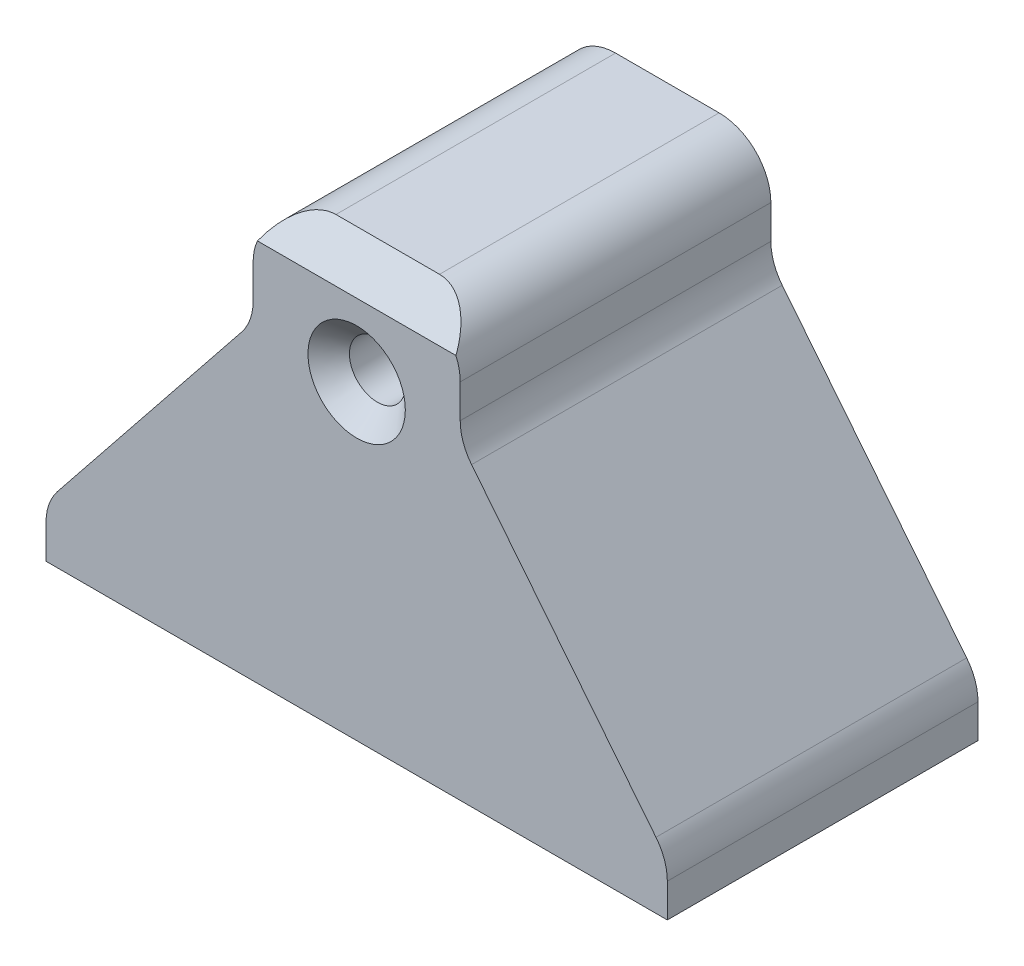
ISO-10303-21;
HEADER;
FILE_DESCRIPTION(('STEP AP214'),'2;1');
FILE_NAME('part.step','',(''),(''),'','','');
FILE_SCHEMA(('AUTOMOTIVE_DESIGN { 1 0 10303 214 1 1 1 1 }'));
ENDSEC;
DATA;
#1=APPLICATION_CONTEXT('core data for automotive mechanical design processes');
#2=APPLICATION_PROTOCOL_DEFINITION('international standard','automotive_design',2000,#1);
#3=PRODUCT_CONTEXT('',#1,'mechanical');
#4=PRODUCT('Part','Part','',(#3));
#5=PRODUCT_RELATED_PRODUCT_CATEGORY('part','',(#4));
#6=PRODUCT_DEFINITION_FORMATION('','',#4);
#7=PRODUCT_DEFINITION_CONTEXT('part definition',#1,'design');
#8=PRODUCT_DEFINITION('design','',#6,#7);
#9=PRODUCT_DEFINITION_SHAPE('','',#8);
#10=(LENGTH_UNIT() NAMED_UNIT(*) SI_UNIT(.MILLI.,.METRE.));
#11=(NAMED_UNIT(*) PLANE_ANGLE_UNIT() SI_UNIT($,.RADIAN.));
#12=(NAMED_UNIT(*) SI_UNIT($,.STERADIAN.) SOLID_ANGLE_UNIT());
#13=UNCERTAINTY_MEASURE_WITH_UNIT(LENGTH_MEASURE(1.E-05),#10,'distance_accuracy_value','');
#14=(GEOMETRIC_REPRESENTATION_CONTEXT(3) GLOBAL_UNCERTAINTY_ASSIGNED_CONTEXT((#13)) GLOBAL_UNIT_ASSIGNED_CONTEXT((#10,
#11,#12)) REPRESENTATION_CONTEXT('',''));
#15=CARTESIAN_POINT('',(0.,0.,0.));
#16=DIRECTION('',(0.,0.,1.));
#17=DIRECTION('',(1.,0.,0.));
#18=AXIS2_PLACEMENT_3D('',#15,#16,#17);
#19=CARTESIAN_POINT('',(12.7,0.,38.1));
#20=DIRECTION('',(1.,0.,0.));
#21=DIRECTION('',(0.,1.,0.));
#22=AXIS2_PLACEMENT_3D('',#19,#20,#21);
#23=PLANE('',#22);
#24=DIRECTION('',(0.,-1.,0.));
#25=VECTOR('',#24,1.);
#26=CARTESIAN_POINT('',(12.7,0.,0.));
#27=LINE('',#26,#25);
#28=CARTESIAN_POINT('',(12.7,6.35,0.));
#29=VERTEX_POINT('',#28);
#30=CARTESIAN_POINT('',(12.7,2.22745972692465,0.));
#31=VERTEX_POINT('',#30);
#32=EDGE_CURVE('E288',#29,#31,#27,.T.);
#33=ORIENTED_EDGE('',*,*,#32,.F.);
#34=DIRECTION('',(0.,0.,-1.));
#35=VECTOR('',#34,1.);
#36=CARTESIAN_POINT('',(12.7,6.35,38.1));
#37=LINE('',#36,#35);
#38=CARTESIAN_POINT('',(12.7,6.35,38.1));
#39=VERTEX_POINT('',#38);
#40=EDGE_CURVE('E395',#29,#39,#37,.F.);
#41=ORIENTED_EDGE('',*,*,#40,.T.);
#42=DIRECTION('',(0.,-1.,0.));
#43=VECTOR('',#42,1.);
#44=CARTESIAN_POINT('',(12.7,0.,38.1));
#45=LINE('',#44,#43);
#46=CARTESIAN_POINT('',(12.7,2.22745972692465,38.1));
#47=VERTEX_POINT('',#46);
#48=EDGE_CURVE('E265',#39,#47,#45,.T.);
#49=ORIENTED_EDGE('',*,*,#48,.T.);
#50=DIRECTION('',(0.,0.,-1.));
#51=VECTOR('',#50,1.);
#52=CARTESIAN_POINT('',(12.7,2.22745972692465,38.1));
#53=LINE('',#52,#51);
#54=EDGE_CURVE('E392',#47,#31,#53,.T.);
#55=ORIENTED_EDGE('',*,*,#54,.T.);
#56=EDGE_LOOP('',(#33,#41,#49,#55));
#57=FACE_BOUND('',#56,.T.);
#58=ADVANCED_FACE('F52',(#57),#23,.T.);
#59=CARTESIAN_POINT('',(0.,12.7,38.1));
#60=DIRECTION('',(0.,1.,0.));
#61=DIRECTION('',(0.,0.,1.));
#62=AXIS2_PLACEMENT_3D('',#59,#60,#61);
#63=PLANE('',#62);
#64=DIRECTION('',(0.,0.,-1.));
#65=VECTOR('',#64,1.);
#66=CARTESIAN_POINT('',(-6.35,12.7,38.1));
#67=LINE('',#66,#65);
#68=CARTESIAN_POINT('',(-6.35,12.7,0.));
#69=VERTEX_POINT('',#68);
#70=CARTESIAN_POINT('',(-6.35,12.7,34.29));
#71=VERTEX_POINT('',#70);
#72=EDGE_CURVE('E389',#69,#71,#67,.F.);
#73=ORIENTED_EDGE('',*,*,#72,.T.);
#74=DIRECTION('',(1.,0.,0.));
#75=VECTOR('',#74,1.);
#76=CARTESIAN_POINT('',(0.,12.7,34.29));
#77=LINE('',#76,#75);
#78=CARTESIAN_POINT('',(6.35,12.7,34.29));
#79=VERTEX_POINT('',#78);
#80=EDGE_CURVE('E412',#71,#79,#77,.T.);
#81=ORIENTED_EDGE('',*,*,#80,.T.);
#82=DIRECTION('',(0.,0.,-1.));
#83=VECTOR('',#82,1.);
#84=CARTESIAN_POINT('',(6.35,12.7,38.1));
#85=LINE('',#84,#83);
#86=CARTESIAN_POINT('',(6.35,12.7,0.));
#87=VERTEX_POINT('',#86);
#88=EDGE_CURVE('E387',#79,#87,#85,.T.);
#89=ORIENTED_EDGE('',*,*,#88,.T.);
#90=DIRECTION('',(1.,0.,0.));
#91=VECTOR('',#90,1.);
#92=CARTESIAN_POINT('',(0.,12.7,0.));
#93=LINE('',#92,#91);
#94=EDGE_CURVE('E291',#69,#87,#93,.T.);
#95=ORIENTED_EDGE('',*,*,#94,.F.);
#96=EDGE_LOOP('',(#73,#81,#89,#95));
#97=FACE_BOUND('',#96,.T.);
#98=ADVANCED_FACE('F417',(#97),#63,.T.);
#99=CARTESIAN_POINT('',(-12.7,0.,38.1));
#100=DIRECTION('',(1.,0.,0.));
#101=DIRECTION('',(0.,1.,0.));
#102=AXIS2_PLACEMENT_3D('',#99,#100,#101);
#103=PLANE('',#102);
#104=DIRECTION('',(0.,-1.,0.));
#105=VECTOR('',#104,1.);
#106=CARTESIAN_POINT('',(-12.7,0.,0.));
#107=LINE('',#106,#105);
#108=CARTESIAN_POINT('',(-12.7,6.35,0.));
#109=VERTEX_POINT('',#108);
#110=CARTESIAN_POINT('',(-12.7,2.22745972692465,0.));
#111=VERTEX_POINT('',#110);
#112=EDGE_CURVE('E294',#109,#111,#107,.T.);
#113=ORIENTED_EDGE('',*,*,#112,.T.);
#114=DIRECTION('',(0.,0.,-1.));
#115=VECTOR('',#114,1.);
#116=CARTESIAN_POINT('',(-12.7,2.22745972692465,38.1));
#117=LINE('',#116,#115);
#118=CARTESIAN_POINT('',(-12.7,2.22745972692465,38.1));
#119=VERTEX_POINT('',#118);
#120=EDGE_CURVE('E385',#111,#119,#117,.F.);
#121=ORIENTED_EDGE('',*,*,#120,.T.);
#122=DIRECTION('',(0.,-1.,0.));
#123=VECTOR('',#122,1.);
#124=CARTESIAN_POINT('',(-12.7,0.,38.1));
#125=LINE('',#124,#123);
#126=CARTESIAN_POINT('',(-12.7,6.35,38.1));
#127=VERTEX_POINT('',#126);
#128=EDGE_CURVE('E268',#127,#119,#125,.T.);
#129=ORIENTED_EDGE('',*,*,#128,.F.);
#130=DIRECTION('',(0.,0.,-1.));
#131=VECTOR('',#130,1.);
#132=CARTESIAN_POINT('',(-12.7,6.35,0.));
#133=LINE('',#132,#131);
#134=EDGE_CURVE('E382',#127,#109,#133,.T.);
#135=ORIENTED_EDGE('',*,*,#134,.T.);
#136=EDGE_LOOP('',(#113,#121,#129,#135));
#137=FACE_BOUND('',#136,.T.);
#138=ADVANCED_FACE('F445',(#137),#103,.F.);
#139=CARTESIAN_POINT('',(-7.74390243902439,6.19512195121951,38.1));
#140=DIRECTION('',(-0.78086880944303,0.624695047554424,0.));
#141=DIRECTION('',(-0.624695047554424,-0.78086880944303,0.));
#142=AXIS2_PLACEMENT_3D('',#139,#140,#141);
#143=PLANE('',#142);
#144=DIRECTION('',(0.624695047554424,0.78086880944303,0.));
#145=VECTOR('',#144,1.);
#146=CARTESIAN_POINT('',(-7.74390243902439,6.19512195121951,0.));
#147=LINE('',#146,#145);
#148=CARTESIAN_POINT('',(-36.7085169399632,-30.0106461749541,0.));
#149=VERTEX_POINT('',#148);
#150=CARTESIAN_POINT('',(-14.0914830600368,-1.73935382504595,0.));
#151=VERTEX_POINT('',#150);
#152=EDGE_CURVE('E297',#149,#151,#147,.T.);
#153=ORIENTED_EDGE('',*,*,#152,.F.);
#154=DIRECTION('',(0.,0.,-1.));
#155=VECTOR('',#154,1.);
#156=CARTESIAN_POINT('',(-36.7085169399632,-30.0106461749541,38.1));
#157=LINE('',#156,#155);
#158=CARTESIAN_POINT('',(-36.7085169399632,-30.0106461749541,38.1));
#159=VERTEX_POINT('',#158);
#160=EDGE_CURVE('E372',#149,#159,#157,.F.);
#161=ORIENTED_EDGE('',*,*,#160,.T.);
#162=DIRECTION('',(0.624695047554424,0.78086880944303,0.));
#163=VECTOR('',#162,1.);
#164=CARTESIAN_POINT('',(-7.74390243902439,6.19512195121951,38.1));
#165=LINE('',#164,#163);
#166=CARTESIAN_POINT('',(-14.0914830600368,-1.73935382504595,38.1));
#167=VERTEX_POINT('',#166);
#168=EDGE_CURVE('E272',#159,#167,#165,.T.);
#169=ORIENTED_EDGE('',*,*,#168,.T.);
#170=DIRECTION('',(0.,0.,-1.));
#171=VECTOR('',#170,1.);
#172=CARTESIAN_POINT('',(-14.0914830600368,-1.73935382504595,38.1));
#173=LINE('',#172,#171);
#174=EDGE_CURVE('E369',#167,#151,#173,.T.);
#175=ORIENTED_EDGE('',*,*,#174,.T.);
#176=EDGE_LOOP('',(#153,#161,#169,#175));
#177=FACE_BOUND('',#176,.T.);
#178=ADVANCED_FACE('F549',(#177),#143,.T.);
#179=CARTESIAN_POINT('',(-38.1,0.,38.1));
#180=DIRECTION('',(-1.,0.,0.));
#181=DIRECTION('',(0.,0.,1.));
#182=AXIS2_PLACEMENT_3D('',#179,#180,#181);
#183=PLANE('',#182);
#184=DIRECTION('',(0.,1.,0.));
#185=VECTOR('',#184,1.);
#186=CARTESIAN_POINT('',(-38.1,0.,38.1));
#187=LINE('',#186,#185);
#188=CARTESIAN_POINT('',(-38.1,-38.1,38.1));
#189=VERTEX_POINT('',#188);
#190=CARTESIAN_POINT('',(-38.1,-33.9774597269247,38.1));
#191=VERTEX_POINT('',#190);
#192=EDGE_CURVE('E275',#189,#191,#187,.T.);
#193=ORIENTED_EDGE('',*,*,#192,.T.);
#194=DIRECTION('',(0.,0.,-1.));
#195=VECTOR('',#194,1.);
#196=CARTESIAN_POINT('',(-38.1,-33.9774597269247,38.1));
#197=LINE('',#196,#195);
#198=CARTESIAN_POINT('',(-38.1,-33.9774597269247,0.));
#199=VERTEX_POINT('',#198);
#200=EDGE_CURVE('E358',#191,#199,#197,.T.);
#201=ORIENTED_EDGE('',*,*,#200,.T.);
#202=DIRECTION('',(0.,1.,0.));
#203=VECTOR('',#202,1.);
#204=CARTESIAN_POINT('',(-38.1,0.,0.));
#205=LINE('',#204,#203);
#206=CARTESIAN_POINT('',(-38.1,-38.1,0.));
#207=VERTEX_POINT('',#206);
#208=EDGE_CURVE('E300',#207,#199,#205,.T.);
#209=ORIENTED_EDGE('',*,*,#208,.F.);
#210=DIRECTION('',(0.,0.,-1.));
#211=VECTOR('',#210,1.);
#212=CARTESIAN_POINT('',(-38.1,-38.1,38.1));
#213=LINE('',#212,#211);
#214=EDGE_CURVE('E312',#189,#207,#213,.T.);
#215=ORIENTED_EDGE('',*,*,#214,.F.);
#216=EDGE_LOOP('',(#193,#201,#209,#215));
#217=FACE_BOUND('',#216,.T.);
#218=ADVANCED_FACE('F542',(#217),#183,.T.);
#219=CARTESIAN_POINT('',(0.,-38.1,38.1));
#220=DIRECTION('',(0.,-1.,0.));
#221=DIRECTION('',(1.,0.,0.));
#222=AXIS2_PLACEMENT_3D('',#219,#220,#221);
#223=PLANE('',#222);
#224=DIRECTION('',(-1.,0.,0.));
#225=VECTOR('',#224,1.);
#226=CARTESIAN_POINT('',(0.,-38.1,0.));
#227=LINE('',#226,#225);
#228=CARTESIAN_POINT('',(38.1,-38.1,0.));
#229=VERTEX_POINT('',#228);
#230=EDGE_CURVE('E303',#229,#207,#227,.T.);
#231=ORIENTED_EDGE('',*,*,#230,.F.);
#232=DIRECTION('',(0.,0.,-1.));
#233=VECTOR('',#232,1.);
#234=CARTESIAN_POINT('',(38.1,-38.1,38.1));
#235=LINE('',#234,#233);
#236=CARTESIAN_POINT('',(38.1,-38.1,38.1));
#237=VERTEX_POINT('',#236);
#238=EDGE_CURVE('E287',#237,#229,#235,.T.);
#239=ORIENTED_EDGE('',*,*,#238,.F.);
#240=DIRECTION('',(-1.,0.,0.));
#241=VECTOR('',#240,1.);
#242=CARTESIAN_POINT('',(0.,-38.1,38.1));
#243=LINE('',#242,#241);
#244=EDGE_CURVE('E278',#237,#189,#243,.T.);
#245=ORIENTED_EDGE('',*,*,#244,.T.);
#246=ORIENTED_EDGE('',*,*,#214,.T.);
#247=EDGE_LOOP('',(#231,#239,#245,#246));
#248=FACE_BOUND('',#247,.T.);
#249=ADVANCED_FACE('F538',(#248),#223,.T.);
#250=CARTESIAN_POINT('',(38.1,0.,38.1));
#251=DIRECTION('',(-1.,0.,0.));
#252=DIRECTION('',(0.,0.,1.));
#253=AXIS2_PLACEMENT_3D('',#250,#251,#252);
#254=PLANE('',#253);
#255=DIRECTION('',(0.,1.,0.));
#256=VECTOR('',#255,1.);
#257=CARTESIAN_POINT('',(38.1,0.,0.));
#258=LINE('',#257,#256);
#259=CARTESIAN_POINT('',(38.1,-33.9774597269246,0.));
#260=VERTEX_POINT('',#259);
#261=EDGE_CURVE('E306',#229,#260,#258,.T.);
#262=ORIENTED_EDGE('',*,*,#261,.T.);
#263=DIRECTION('',(0.,0.,-1.));
#264=VECTOR('',#263,1.);
#265=CARTESIAN_POINT('',(38.1,-33.9774597269246,38.1));
#266=LINE('',#265,#264);
#267=CARTESIAN_POINT('',(38.1,-33.9774597269246,38.1));
#268=VERTEX_POINT('',#267);
#269=EDGE_CURVE('E402',#260,#268,#266,.F.);
#270=ORIENTED_EDGE('',*,*,#269,.T.);
#271=DIRECTION('',(0.,1.,0.));
#272=VECTOR('',#271,1.);
#273=CARTESIAN_POINT('',(38.1,0.,38.1));
#274=LINE('',#273,#272);
#275=EDGE_CURVE('E281',#237,#268,#274,.T.);
#276=ORIENTED_EDGE('',*,*,#275,.F.);
#277=ORIENTED_EDGE('',*,*,#238,.T.);
#278=EDGE_LOOP('',(#262,#270,#276,#277));
#279=FACE_BOUND('',#278,.T.);
#280=ADVANCED_FACE('F453',(#279),#254,.F.);
#281=CARTESIAN_POINT('',(0.,0.,38.1));
#282=DIRECTION('',(0.,0.,-1.));
#283=DIRECTION('',(-1.,0.,0.));
#284=AXIS2_PLACEMENT_3D('',#281,#282,#283);
#285=CYLINDRICAL_SURFACE('',#284,3.429);
#286=CARTESIAN_POINT('',(0.,0.,35.56));
#287=DIRECTION('',(0.,0.,1.));
#288=DIRECTION('',(1.,0.,0.));
#289=AXIS2_PLACEMENT_3D('',#286,#287,#288);
#290=CIRCLE('',#289,3.429);
#291=CARTESIAN_POINT('',(-3.429,0.,35.5599999999999));
#292=VERTEX_POINT('',#291);
#293=EDGE_CURVE('E340',#292,#292,#290,.T.);
#294=CARTESIAN_POINT('',(0.,0.,19.05));
#295=DIRECTION('',(0.,0.,1.));
#296=DIRECTION('',(1.,0.,0.));
#297=AXIS2_PLACEMENT_3D('',#294,#295,#296);
#298=CIRCLE('',#297,3.429);
#299=CARTESIAN_POINT('',(-3.429,0.,19.05));
#300=VERTEX_POINT('',#299);
#301=EDGE_CURVE('E264',#300,#300,#298,.T.);
#302=CARTESIAN_POINT('',(-3.429,0.,35.5599999999999));
#303=CARTESIAN_POINT('',(-3.429,0.,35.3880208333333));
#304=CARTESIAN_POINT('',(-3.429,0.,35.2160416666666));
#305=CARTESIAN_POINT('',(-3.429,0.,34.8720833333333));
#306=CARTESIAN_POINT('',(-3.429,0.,34.7001041666666));
#307=CARTESIAN_POINT('',(-3.429,0.,34.3561458333333));
#308=CARTESIAN_POINT('',(-3.429,0.,34.1841666666666));
#309=CARTESIAN_POINT('',(-3.429,0.,33.8402083333333));
#310=CARTESIAN_POINT('',(-3.429,0.,33.6682291666666));
#311=CARTESIAN_POINT('',(-3.429,0.,33.3242708333333));
#312=CARTESIAN_POINT('',(-3.429,0.,33.1522916666666));
#313=CARTESIAN_POINT('',(-3.429,0.,32.8083333333333));
#314=CARTESIAN_POINT('',(-3.429,0.,32.6363541666666));
#315=CARTESIAN_POINT('',(-3.429,0.,32.2923958333333));
#316=CARTESIAN_POINT('',(-3.429,0.,32.1204166666666));
#317=CARTESIAN_POINT('',(-3.429,0.,31.7764583333333));
#318=CARTESIAN_POINT('',(-3.429,0.,31.6044791666666));
#319=CARTESIAN_POINT('',(-3.429,0.,31.2605208333333));
#320=CARTESIAN_POINT('',(-3.429,0.,31.0885416666666));
#321=CARTESIAN_POINT('',(-3.429,0.,30.7445833333333));
#322=CARTESIAN_POINT('',(-3.429,0.,30.5726041666666));
#323=CARTESIAN_POINT('',(-3.429,0.,30.2286458333333));
#324=CARTESIAN_POINT('',(-3.429,0.,30.0566666666666));
#325=CARTESIAN_POINT('',(-3.429,0.,29.7127083333333));
#326=CARTESIAN_POINT('',(-3.429,0.,29.5407291666666));
#327=CARTESIAN_POINT('',(-3.429,0.,29.1967708333333));
#328=CARTESIAN_POINT('',(-3.429,0.,29.0247916666666));
#329=CARTESIAN_POINT('',(-3.429,0.,28.6808333333333));
#330=CARTESIAN_POINT('',(-3.429,0.,28.5088541666666));
#331=CARTESIAN_POINT('',(-3.429,0.,28.1648958333333));
#332=CARTESIAN_POINT('',(-3.429,0.,27.9929166666666));
#333=CARTESIAN_POINT('',(-3.429,0.,27.6489583333333));
#334=CARTESIAN_POINT('',(-3.429,0.,27.4769791666666));
#335=CARTESIAN_POINT('',(-3.429,0.,27.1330208333333));
#336=CARTESIAN_POINT('',(-3.429,0.,26.9610416666666));
#337=CARTESIAN_POINT('',(-3.429,0.,26.6170833333333));
#338=CARTESIAN_POINT('',(-3.429,0.,26.4451041666666));
#339=CARTESIAN_POINT('',(-3.429,0.,26.1011458333333));
#340=CARTESIAN_POINT('',(-3.429,0.,25.9291666666666));
#341=CARTESIAN_POINT('',(-3.429,0.,25.5852083333333));
#342=CARTESIAN_POINT('',(-3.429,0.,25.4132291666666));
#343=CARTESIAN_POINT('',(-3.429,0.,25.0692708333333));
#344=CARTESIAN_POINT('',(-3.429,0.,24.8972916666666));
#345=CARTESIAN_POINT('',(-3.429,0.,24.5533333333333));
#346=CARTESIAN_POINT('',(-3.429,0.,24.3813541666667));
#347=CARTESIAN_POINT('',(-3.429,0.,24.0373958333333));
#348=CARTESIAN_POINT('',(-3.429,0.,23.8654166666667));
#349=CARTESIAN_POINT('',(-3.429,0.,23.5214583333333));
#350=CARTESIAN_POINT('',(-3.429,0.,23.3494791666667));
#351=CARTESIAN_POINT('',(-3.429,0.,23.0055208333333));
#352=CARTESIAN_POINT('',(-3.429,0.,22.8335416666667));
#353=CARTESIAN_POINT('',(-3.429,0.,22.4895833333333));
#354=CARTESIAN_POINT('',(-3.429,0.,22.3176041666667));
#355=CARTESIAN_POINT('',(-3.429,0.,21.9736458333333));
#356=CARTESIAN_POINT('',(-3.429,0.,21.8016666666667));
#357=CARTESIAN_POINT('',(-3.429,0.,21.4577083333333));
#358=CARTESIAN_POINT('',(-3.429,0.,21.2857291666667));
#359=CARTESIAN_POINT('',(-3.429,0.,20.9417708333333));
#360=CARTESIAN_POINT('',(-3.429,0.,20.7697916666667));
#361=CARTESIAN_POINT('',(-3.429,0.,20.4258333333333));
#362=CARTESIAN_POINT('',(-3.429,0.,20.2538541666667));
#363=CARTESIAN_POINT('',(-3.429,0.,19.9098958333333));
#364=CARTESIAN_POINT('',(-3.429,0.,19.7379166666667));
#365=CARTESIAN_POINT('',(-3.429,0.,19.3939583333333));
#366=CARTESIAN_POINT('',(-3.429,0.,19.2219791666667));
#367=CARTESIAN_POINT('',(-3.429,0.,19.05));
#368=B_SPLINE_CURVE_WITH_KNOTS('',3,(#302,#303,#304,#305,#306,#307,#308,#309,#310,#311,#312,
#313,#314,#315,#316,#317,#318,#319,#320,#321,#322,#323,#324,#325,#326,#327,#328,#329,#330,#331,
#332,#333,#334,#335,#336,#337,#338,#339,#340,#341,#342,#343,#344,#345,#346,#347,#348,#349,#350,
#351,#352,#353,#354,#355,#356,#357,#358,#359,#360,#361,#362,#363,#364,#365,#366,#367),
.UNSPECIFIED.,.F.,.F.,(4,2,2,2,2,2,2,2,2,2,2,2,2,2,2,2,2,2,2,2,2,2,2,2,2,2,2,2,2,2,2,2,4),(0.,
0.515937499999994,1.03187499999999,1.54781249999999,2.06374999999999,2.57968749999999,
3.09562499999998,3.61156249999998,4.12749999999999,4.64343749999998,5.15937499999998,
5.67531249999998,6.19124999999997,6.70718749999997,7.22312499999998,7.73906249999997,
8.25499999999997,8.77093749999997,9.28687499999996,9.80281249999997,10.31875,10.8346875,
11.350625,11.8665625,12.3825,12.8984375,13.414375,13.9303125,14.44625,14.9621874999999,
15.478125,15.9940624999999,16.5099999999999),.UNSPECIFIED.);
#369=EDGE_CURVE('BSEAM449',#292,#300,#368,.T.);
#370=ORIENTED_EDGE('',*,*,#293,.T.);
#371=ORIENTED_EDGE('',*,*,#301,.F.);
#372=ORIENTED_EDGE('',*,*,#369,.T.);
#373=ORIENTED_EDGE('',*,*,#369,.F.);
#374=EDGE_LOOP('',(#370,#372,#371,#373));
#375=FACE_BOUND('',#374,.T.);
#376=ADVANCED_FACE('F449',(#375),#285,.F.);
#377=CARTESIAN_POINT('',(7.74390243902439,6.19512195121952,38.1));
#378=DIRECTION('',(-0.78086880944303,-0.624695047554424,0.));
#379=DIRECTION('',(0.624695047554424,-0.78086880944303,0.));
#380=AXIS2_PLACEMENT_3D('',#377,#378,#379);
#381=PLANE('',#380);
#382=DIRECTION('',(-0.624695047554424,0.78086880944303,0.));
#383=VECTOR('',#382,1.);
#384=CARTESIAN_POINT('',(7.74390243902439,6.19512195121952,38.1));
#385=LINE('',#384,#383);
#386=CARTESIAN_POINT('',(36.7085169399632,-30.010646174954,38.1));
#387=VERTEX_POINT('',#386);
#388=CARTESIAN_POINT('',(14.0914830600368,-1.73935382504594,38.1));
#389=VERTEX_POINT('',#388);
#390=EDGE_CURVE('E284',#387,#389,#385,.T.);
#391=ORIENTED_EDGE('',*,*,#390,.F.);
#392=DIRECTION('',(0.,0.,-1.));
#393=VECTOR('',#392,1.);
#394=CARTESIAN_POINT('',(36.7085169399632,-30.010646174954,38.1));
#395=LINE('',#394,#393);
#396=CARTESIAN_POINT('',(36.7085169399632,-30.010646174954,0.));
#397=VERTEX_POINT('',#396);
#398=EDGE_CURVE('E399',#387,#397,#395,.T.);
#399=ORIENTED_EDGE('',*,*,#398,.T.);
#400=DIRECTION('',(-0.624695047554424,0.78086880944303,0.));
#401=VECTOR('',#400,1.);
#402=CARTESIAN_POINT('',(7.74390243902439,6.19512195121952,0.));
#403=LINE('',#402,#401);
#404=CARTESIAN_POINT('',(14.0914830600368,-1.73935382504594,0.));
#405=VERTEX_POINT('',#404);
#406=EDGE_CURVE('E269',#397,#405,#403,.T.);
#407=ORIENTED_EDGE('',*,*,#406,.T.);
#408=DIRECTION('',(0.,0.,-1.));
#409=VECTOR('',#408,1.);
#410=CARTESIAN_POINT('',(14.0914830600368,-1.73935382504594,38.1));
#411=LINE('',#410,#409);
#412=EDGE_CURVE('E397',#405,#389,#411,.F.);
#413=ORIENTED_EDGE('',*,*,#412,.T.);
#414=EDGE_LOOP('',(#391,#399,#407,#413));
#415=FACE_BOUND('',#414,.T.);
#416=ADVANCED_FACE('F452',(#415),#381,.F.);
#417=CARTESIAN_POINT('',(0.,0.,38.1));
#418=DIRECTION('',(0.,0.,1.));
#419=DIRECTION('',(1.,0.,0.));
#420=AXIS2_PLACEMENT_3D('',#417,#418,#419);
#421=PLANE('',#420);
#422=CARTESIAN_POINT('',(0.,0.,38.1));
#423=DIRECTION('',(0.,0.,1.));
#424=DIRECTION('',(1.,0.,0.));
#425=AXIS2_PLACEMENT_3D('',#422,#423,#424);
#426=CIRCLE('',#425,5.96900000000007);
#427=CARTESIAN_POINT('',(5.96900000000007,0.,38.1));
#428=VERTEX_POINT('',#427);
#429=EDGE_CURVE('E355',#428,#428,#426,.F.);
#430=ORIENTED_EDGE('',*,*,#429,.T.);
#431=EDGE_LOOP('',(#430));
#432=FACE_BOUND('',#431,.T.);
#433=CARTESIAN_POINT('',(6.35,6.35,38.1));
#434=DIRECTION('',(0.,0.,1.));
#435=DIRECTION('',(1.,0.,0.));
#436=AXIS2_PLACEMENT_3D('',#433,#434,#435);
#437=CIRCLE('',#436,6.35);
#438=CARTESIAN_POINT('',(12.1698711325939,8.89000000000001,38.1));
#439=VERTEX_POINT('',#438);
#440=EDGE_CURVE('E376',#39,#439,#437,.T.);
#441=ORIENTED_EDGE('',*,*,#440,.T.);
#442=DIRECTION('',(-1.,0.,0.));
#443=VECTOR('',#442,1.);
#444=CARTESIAN_POINT('',(0.,8.89000000000001,38.1));
#445=LINE('',#444,#443);
#446=CARTESIAN_POINT('',(-12.1698711325939,8.89000000000001,38.1));
#447=VERTEX_POINT('',#446);
#448=EDGE_CURVE('E61',#439,#447,#445,.T.);
#449=ORIENTED_EDGE('',*,*,#448,.T.);
#450=CARTESIAN_POINT('',(-6.35,6.35,38.1));
#451=DIRECTION('',(0.,0.,1.));
#452=DIRECTION('',(1.,0.,0.));
#453=AXIS2_PLACEMENT_3D('',#450,#451,#452);
#454=CIRCLE('',#453,6.35);
#455=EDGE_CURVE('E378',#447,#127,#454,.T.);
#456=ORIENTED_EDGE('',*,*,#455,.T.);
#457=ORIENTED_EDGE('',*,*,#128,.T.);
#458=CARTESIAN_POINT('',(-19.05,2.22745972692465,38.1));
#459=DIRECTION('',(0.,0.,1.));
#460=DIRECTION('',(1.,0.,0.));
#461=AXIS2_PLACEMENT_3D('',#458,#459,#460);
#462=CIRCLE('',#461,6.35);
#463=EDGE_CURVE('E406',#119,#167,#462,.F.);
#464=ORIENTED_EDGE('',*,*,#463,.T.);
#465=ORIENTED_EDGE('',*,*,#168,.F.);
#466=CARTESIAN_POINT('',(-31.75,-33.9774597269247,38.1));
#467=DIRECTION('',(0.,0.,1.));
#468=DIRECTION('',(1.,0.,0.));
#469=AXIS2_PLACEMENT_3D('',#466,#467,#468);
#470=CIRCLE('',#469,6.35);
#471=EDGE_CURVE('E380',#159,#191,#470,.T.);
#472=ORIENTED_EDGE('',*,*,#471,.T.);
#473=ORIENTED_EDGE('',*,*,#192,.F.);
#474=ORIENTED_EDGE('',*,*,#244,.F.);
#475=ORIENTED_EDGE('',*,*,#275,.T.);
#476=CARTESIAN_POINT('',(31.75,-33.9774597269246,38.1));
#477=DIRECTION('',(0.,0.,1.));
#478=DIRECTION('',(1.,0.,0.));
#479=AXIS2_PLACEMENT_3D('',#476,#477,#478);
#480=CIRCLE('',#479,6.35);
#481=EDGE_CURVE('E374',#268,#387,#480,.T.);
#482=ORIENTED_EDGE('',*,*,#481,.T.);
#483=ORIENTED_EDGE('',*,*,#390,.T.);
#484=CARTESIAN_POINT('',(19.05,2.22745972692465,38.1));
#485=DIRECTION('',(0.,0.,1.));
#486=DIRECTION('',(1.,0.,0.));
#487=AXIS2_PLACEMENT_3D('',#484,#485,#486);
#488=CIRCLE('',#487,6.35);
#489=EDGE_CURVE('E410',#389,#47,#488,.F.);
#490=ORIENTED_EDGE('',*,*,#489,.T.);
#491=ORIENTED_EDGE('',*,*,#48,.F.);
#492=EDGE_LOOP('',(#441,#449,#456,#457,#464,#465,#472,#473,#474,#475,#482,#483,#490,#491));
#493=FACE_BOUND('',#492,.T.);
#494=ADVANCED_FACE('F525',(#432,#493),#421,.T.);
#495=CARTESIAN_POINT('',(0.,0.,0.));
#496=DIRECTION('',(0.,0.,1.));
#497=DIRECTION('',(1.,0.,0.));
#498=AXIS2_PLACEMENT_3D('',#495,#496,#497);
#499=PLANE('',#498);
#500=DIRECTION('',(-0.5,0.866025403784439,0.));
#501=VECTOR('',#500,1.);
#502=CARTESIAN_POINT('',(7.25902493452118,4.19100000000001,0.));
#503=LINE('',#502,#501);
#504=CARTESIAN_POINT('',(9.67869991269491,0.,0.));
#505=VERTEX_POINT('',#504);
#506=CARTESIAN_POINT('',(4.83934995634746,8.38200000000002,0.));
#507=VERTEX_POINT('',#506);
#508=EDGE_CURVE('E318',#505,#507,#503,.T.);
#509=ORIENTED_EDGE('',*,*,#508,.T.);
#510=DIRECTION('',(-1.,0.,0.));
#511=VECTOR('',#510,1.);
#512=CARTESIAN_POINT('',(0.,8.38200000000002,0.));
#513=LINE('',#512,#511);
#514=CARTESIAN_POINT('',(-4.83934995634745,8.38200000000002,0.));
#515=VERTEX_POINT('',#514);
#516=EDGE_CURVE('E328',#507,#515,#513,.T.);
#517=ORIENTED_EDGE('',*,*,#516,.T.);
#518=DIRECTION('',(-0.5,-0.866025403784439,0.));
#519=VECTOR('',#518,1.);
#520=CARTESIAN_POINT('',(-7.25902493452118,4.19100000000001,0.));
#521=LINE('',#520,#519);
#522=CARTESIAN_POINT('',(-9.67869991269491,0.,0.));
#523=VERTEX_POINT('',#522);
#524=EDGE_CURVE('E326',#515,#523,#521,.T.);
#525=ORIENTED_EDGE('',*,*,#524,.T.);
#526=DIRECTION('',(0.5,-0.866025403784439,0.));
#527=VECTOR('',#526,1.);
#528=CARTESIAN_POINT('',(-7.25902493452118,-4.19100000000001,0.));
#529=LINE('',#528,#527);
#530=CARTESIAN_POINT('',(-4.83934995634746,-8.38200000000002,0.));
#531=VERTEX_POINT('',#530);
#532=EDGE_CURVE('E324',#523,#531,#529,.T.);
#533=ORIENTED_EDGE('',*,*,#532,.T.);
#534=DIRECTION('',(1.,0.,0.));
#535=VECTOR('',#534,1.);
#536=CARTESIAN_POINT('',(0.,-8.38200000000002,0.));
#537=LINE('',#536,#535);
#538=CARTESIAN_POINT('',(4.83934995634745,-8.38200000000002,0.));
#539=VERTEX_POINT('',#538);
#540=EDGE_CURVE('E322',#531,#539,#537,.T.);
#541=ORIENTED_EDGE('',*,*,#540,.T.);
#542=DIRECTION('',(0.5,0.866025403784439,0.));
#543=VECTOR('',#542,1.);
#544=CARTESIAN_POINT('',(7.25902493452118,-4.19100000000001,0.));
#545=LINE('',#544,#543);
#546=EDGE_CURVE('E320',#539,#505,#545,.T.);
#547=ORIENTED_EDGE('',*,*,#546,.T.);
#548=EDGE_LOOP('',(#509,#517,#525,#533,#541,#547));
#549=FACE_BOUND('',#548,.T.);
#550=ORIENTED_EDGE('',*,*,#208,.T.);
#551=CARTESIAN_POINT('',(-31.75,-33.9774597269247,0.));
#552=DIRECTION('',(0.,0.,1.));
#553=DIRECTION('',(1.,0.,0.));
#554=AXIS2_PLACEMENT_3D('',#551,#552,#553);
#555=CIRCLE('',#554,6.35);
#556=EDGE_CURVE('E367',#199,#149,#555,.F.);
#557=ORIENTED_EDGE('',*,*,#556,.T.);
#558=ORIENTED_EDGE('',*,*,#152,.T.);
#559=CARTESIAN_POINT('',(-19.05,2.22745972692465,0.));
#560=DIRECTION('',(0.,0.,1.));
#561=DIRECTION('',(1.,0.,0.));
#562=AXIS2_PLACEMENT_3D('',#559,#560,#561);
#563=CIRCLE('',#562,6.35);
#564=EDGE_CURVE('E404',#151,#111,#563,.T.);
#565=ORIENTED_EDGE('',*,*,#564,.T.);
#566=ORIENTED_EDGE('',*,*,#112,.F.);
#567=CARTESIAN_POINT('',(-6.35,6.35,0.));
#568=DIRECTION('',(0.,0.,1.));
#569=DIRECTION('',(1.,0.,0.));
#570=AXIS2_PLACEMENT_3D('',#567,#568,#569);
#571=CIRCLE('',#570,6.35);
#572=EDGE_CURVE('E365',#109,#69,#571,.F.);
#573=ORIENTED_EDGE('',*,*,#572,.T.);
#574=ORIENTED_EDGE('',*,*,#94,.T.);
#575=CARTESIAN_POINT('',(6.35,6.35,0.));
#576=DIRECTION('',(0.,0.,1.));
#577=DIRECTION('',(1.,0.,0.));
#578=AXIS2_PLACEMENT_3D('',#575,#576,#577);
#579=CIRCLE('',#578,6.35);
#580=EDGE_CURVE('E363',#87,#29,#579,.F.);
#581=ORIENTED_EDGE('',*,*,#580,.T.);
#582=ORIENTED_EDGE('',*,*,#32,.T.);
#583=CARTESIAN_POINT('',(19.05,2.22745972692465,0.));
#584=DIRECTION('',(0.,0.,1.));
#585=DIRECTION('',(1.,0.,0.));
#586=AXIS2_PLACEMENT_3D('',#583,#584,#585);
#587=CIRCLE('',#586,6.35);
#588=EDGE_CURVE('E408',#31,#405,#587,.T.);
#589=ORIENTED_EDGE('',*,*,#588,.T.);
#590=ORIENTED_EDGE('',*,*,#406,.F.);
#591=CARTESIAN_POINT('',(31.75,-33.9774597269246,0.));
#592=DIRECTION('',(0.,0.,1.));
#593=DIRECTION('',(1.,0.,0.));
#594=AXIS2_PLACEMENT_3D('',#591,#592,#593);
#595=CIRCLE('',#594,6.35);
#596=EDGE_CURVE('E361',#397,#260,#595,.F.);
#597=ORIENTED_EDGE('',*,*,#596,.T.);
#598=ORIENTED_EDGE('',*,*,#261,.F.);
#599=ORIENTED_EDGE('',*,*,#230,.T.);
#600=EDGE_LOOP('',(#550,#557,#558,#565,#566,#573,#574,#581,#582,#589,#590,#597,#598,#599));
#601=FACE_BOUND('',#600,.T.);
#602=ADVANCED_FACE('F427',(#549,#601),#499,.F.);
#603=CARTESIAN_POINT('',(0.,0.,19.05));
#604=DIRECTION('',(0.,0.,1.));
#605=DIRECTION('',(1.,0.,0.));
#606=AXIS2_PLACEMENT_3D('',#603,#604,#605);
#607=PLANE('',#606);
#608=ORIENTED_EDGE('',*,*,#301,.T.);
#609=EDGE_LOOP('',(#608));
#610=FACE_BOUND('',#609,.T.);
#611=DIRECTION('',(-0.5,0.866025403784439,0.));
#612=VECTOR('',#611,1.);
#613=CARTESIAN_POINT('',(-3.3728802726058,-5.842,19.05));
#614=LINE('',#613,#612);
#615=CARTESIAN_POINT('',(-3.3728802726058,-5.842,19.05));
#616=VERTEX_POINT('',#615);
#617=CARTESIAN_POINT('',(-6.74576054521159,0.,19.05));
#618=VERTEX_POINT('',#617);
#619=EDGE_CURVE('E236',#616,#618,#614,.T.);
#620=ORIENTED_EDGE('',*,*,#619,.T.);
#621=DIRECTION('',(0.5,0.866025403784439,0.));
#622=VECTOR('',#621,1.);
#623=CARTESIAN_POINT('',(-6.74576054521159,0.,19.05));
#624=LINE('',#623,#622);
#625=CARTESIAN_POINT('',(-3.37288027260579,5.842,19.05));
#626=VERTEX_POINT('',#625);
#627=EDGE_CURVE('E229',#618,#626,#624,.T.);
#628=ORIENTED_EDGE('',*,*,#627,.T.);
#629=DIRECTION('',(1.,0.,0.));
#630=VECTOR('',#629,1.);
#631=CARTESIAN_POINT('',(-3.37288027260579,5.842,19.05));
#632=LINE('',#631,#630);
#633=CARTESIAN_POINT('',(3.37288027260579,5.842,19.05));
#634=VERTEX_POINT('',#633);
#635=EDGE_CURVE('E214',#626,#634,#632,.T.);
#636=ORIENTED_EDGE('',*,*,#635,.T.);
#637=DIRECTION('',(0.5,-0.866025403784439,0.));
#638=VECTOR('',#637,1.);
#639=CARTESIAN_POINT('',(3.37288027260579,5.842,19.05));
#640=LINE('',#639,#638);
#641=CARTESIAN_POINT('',(6.74576054521159,0.,19.05));
#642=VERTEX_POINT('',#641);
#643=EDGE_CURVE('E254',#634,#642,#640,.T.);
#644=ORIENTED_EDGE('',*,*,#643,.T.);
#645=DIRECTION('',(-0.5,-0.866025403784439,0.));
#646=VECTOR('',#645,1.);
#647=CARTESIAN_POINT('',(6.74576054521159,0.,19.05));
#648=LINE('',#647,#646);
#649=CARTESIAN_POINT('',(3.37288027260579,-5.842,19.05));
#650=VERTEX_POINT('',#649);
#651=EDGE_CURVE('E250',#642,#650,#648,.T.);
#652=ORIENTED_EDGE('',*,*,#651,.T.);
#653=DIRECTION('',(-1.,0.,0.));
#654=VECTOR('',#653,1.);
#655=CARTESIAN_POINT('',(3.37288027260579,-5.842,19.05));
#656=LINE('',#655,#654);
#657=EDGE_CURVE('E247',#650,#616,#656,.T.);
#658=ORIENTED_EDGE('',*,*,#657,.T.);
#659=EDGE_LOOP('',(#620,#628,#636,#644,#652,#658));
#660=FACE_BOUND('',#659,.T.);
#661=ADVANCED_FACE('F234',(#610,#660),#607,.F.);
#662=CARTESIAN_POINT('',(-6.74576054521159,0.,55.9476048066213));
#663=DIRECTION('',(-0.866025403784438,0.5,0.));
#664=DIRECTION('',(-0.5,-0.866025403784439,0.));
#665=AXIS2_PLACEMENT_3D('',#662,#663,#664);
#666=PLANE('',#665);
#667=DIRECTION('',(0.,0.,-1.));
#668=VECTOR('',#667,1.);
#669=CARTESIAN_POINT('',(-6.74576054521159,0.,55.9476048066213));
#670=LINE('',#669,#668);
#671=CARTESIAN_POINT('',(-6.74576054521159,0.,2.54000000000001));
#672=VERTEX_POINT('',#671);
#673=EDGE_CURVE('E245',#618,#672,#670,.T.);
#674=ORIENTED_EDGE('',*,*,#673,.T.);
#675=DIRECTION('',(0.5,0.866025403784439,0.));
#676=VECTOR('',#675,1.);
#677=CARTESIAN_POINT('',(-6.74576054521159,0.,2.54000000000001));
#678=LINE('',#677,#676);
#679=CARTESIAN_POINT('',(-3.37288027260579,5.842,2.54000000000001));
#680=VERTEX_POINT('',#679);
#681=EDGE_CURVE('E232',#672,#680,#678,.T.);
#682=ORIENTED_EDGE('',*,*,#681,.T.);
#683=DIRECTION('',(0.,0.,-1.));
#684=VECTOR('',#683,1.);
#685=CARTESIAN_POINT('',(-3.37288027260579,5.842,55.9476048066213));
#686=LINE('',#685,#684);
#687=EDGE_CURVE('E218',#626,#680,#686,.T.);
#688=ORIENTED_EDGE('',*,*,#687,.F.);
#689=ORIENTED_EDGE('',*,*,#627,.F.);
#690=EDGE_LOOP('',(#674,#682,#688,#689));
#691=FACE_BOUND('',#690,.T.);
#692=ADVANCED_FACE('F228',(#691),#666,.F.);
#693=CARTESIAN_POINT('',(-3.37288027260579,5.842,55.9476048066213));
#694=DIRECTION('',(0.,1.,0.));
#695=DIRECTION('',(-1.,0.,0.));
#696=AXIS2_PLACEMENT_3D('',#693,#694,#695);
#697=PLANE('',#696);
#698=ORIENTED_EDGE('',*,*,#687,.T.);
#699=DIRECTION('',(1.,0.,0.));
#700=VECTOR('',#699,1.);
#701=CARTESIAN_POINT('',(-3.37288027260579,5.842,2.54000000000001));
#702=LINE('',#701,#700);
#703=CARTESIAN_POINT('',(3.37288027260579,5.842,2.54000000000001));
#704=VERTEX_POINT('',#703);
#705=EDGE_CURVE('E314',#680,#704,#702,.T.);
#706=ORIENTED_EDGE('',*,*,#705,.T.);
#707=DIRECTION('',(0.,0.,-1.));
#708=VECTOR('',#707,1.);
#709=CARTESIAN_POINT('',(3.37288027260579,5.842,55.9476048066213));
#710=LINE('',#709,#708);
#711=EDGE_CURVE('E221',#634,#704,#710,.T.);
#712=ORIENTED_EDGE('',*,*,#711,.F.);
#713=ORIENTED_EDGE('',*,*,#635,.F.);
#714=EDGE_LOOP('',(#698,#706,#712,#713));
#715=FACE_BOUND('',#714,.T.);
#716=ADVANCED_FACE('F216',(#715),#697,.F.);
#717=CARTESIAN_POINT('',(3.37288027260579,5.842,55.9476048066213));
#718=DIRECTION('',(0.866025403784439,0.5,0.));
#719=DIRECTION('',(-0.5,0.866025403784439,0.));
#720=AXIS2_PLACEMENT_3D('',#717,#718,#719);
#721=PLANE('',#720);
#722=ORIENTED_EDGE('',*,*,#711,.T.);
#723=DIRECTION('',(0.5,-0.866025403784439,0.));
#724=VECTOR('',#723,1.);
#725=CARTESIAN_POINT('',(3.37288027260579,5.842,2.54000000000001));
#726=LINE('',#725,#724);
#727=CARTESIAN_POINT('',(6.74576054521159,0.,2.54000000000001));
#728=VERTEX_POINT('',#727);
#729=EDGE_CURVE('E338',#704,#728,#726,.T.);
#730=ORIENTED_EDGE('',*,*,#729,.T.);
#731=DIRECTION('',(0.,0.,-1.));
#732=VECTOR('',#731,1.);
#733=CARTESIAN_POINT('',(6.74576054521159,0.,55.9476048066213));
#734=LINE('',#733,#732);
#735=EDGE_CURVE('E253',#642,#728,#734,.T.);
#736=ORIENTED_EDGE('',*,*,#735,.F.);
#737=ORIENTED_EDGE('',*,*,#643,.F.);
#738=EDGE_LOOP('',(#722,#730,#736,#737));
#739=FACE_BOUND('',#738,.T.);
#740=ADVANCED_FACE('F582',(#739),#721,.F.);
#741=CARTESIAN_POINT('',(6.74576054521159,0.,55.9476048066213));
#742=DIRECTION('',(0.866025403784438,-0.5,0.));
#743=DIRECTION('',(0.5,0.866025403784439,0.));
#744=AXIS2_PLACEMENT_3D('',#741,#742,#743);
#745=PLANE('',#744);
#746=ORIENTED_EDGE('',*,*,#735,.T.);
#747=DIRECTION('',(-0.5,-0.866025403784439,0.));
#748=VECTOR('',#747,1.);
#749=CARTESIAN_POINT('',(6.74576054521159,0.,2.54000000000001));
#750=LINE('',#749,#748);
#751=CARTESIAN_POINT('',(3.37288027260579,-5.842,2.54000000000001));
#752=VERTEX_POINT('',#751);
#753=EDGE_CURVE('E336',#728,#752,#750,.T.);
#754=ORIENTED_EDGE('',*,*,#753,.T.);
#755=DIRECTION('',(0.,0.,-1.));
#756=VECTOR('',#755,1.);
#757=CARTESIAN_POINT('',(3.37288027260579,-5.842,55.9476048066213));
#758=LINE('',#757,#756);
#759=EDGE_CURVE('E249',#650,#752,#758,.T.);
#760=ORIENTED_EDGE('',*,*,#759,.F.);
#761=ORIENTED_EDGE('',*,*,#651,.F.);
#762=EDGE_LOOP('',(#746,#754,#760,#761));
#763=FACE_BOUND('',#762,.T.);
#764=ADVANCED_FACE('F585',(#763),#745,.F.);
#765=CARTESIAN_POINT('',(3.37288027260579,-5.842,55.9476048066213));
#766=DIRECTION('',(0.,-1.,0.));
#767=DIRECTION('',(0.,0.,-1.));
#768=AXIS2_PLACEMENT_3D('',#765,#766,#767);
#769=PLANE('',#768);
#770=ORIENTED_EDGE('',*,*,#759,.T.);
#771=DIRECTION('',(-1.,0.,0.));
#772=VECTOR('',#771,1.);
#773=CARTESIAN_POINT('',(3.37288027260579,-5.842,2.54000000000001));
#774=LINE('',#773,#772);
#775=CARTESIAN_POINT('',(-3.3728802726058,-5.842,2.54000000000001));
#776=VERTEX_POINT('',#775);
#777=EDGE_CURVE('E334',#752,#776,#774,.T.);
#778=ORIENTED_EDGE('',*,*,#777,.T.);
#779=DIRECTION('',(0.,0.,-1.));
#780=VECTOR('',#779,1.);
#781=CARTESIAN_POINT('',(-3.3728802726058,-5.842,55.9476048066213));
#782=LINE('',#781,#780);
#783=EDGE_CURVE('E246',#616,#776,#782,.T.);
#784=ORIENTED_EDGE('',*,*,#783,.F.);
#785=ORIENTED_EDGE('',*,*,#657,.F.);
#786=EDGE_LOOP('',(#770,#778,#784,#785));
#787=FACE_BOUND('',#786,.T.);
#788=ADVANCED_FACE('F589',(#787),#769,.F.);
#789=CARTESIAN_POINT('',(-3.3728802726058,-5.842,55.9476048066213));
#790=DIRECTION('',(-0.866025403784439,-0.5,0.));
#791=DIRECTION('',(0.5,-0.866025403784439,0.));
#792=AXIS2_PLACEMENT_3D('',#789,#790,#791);
#793=PLANE('',#792);
#794=ORIENTED_EDGE('',*,*,#783,.T.);
#795=DIRECTION('',(-0.5,0.866025403784439,0.));
#796=VECTOR('',#795,1.);
#797=CARTESIAN_POINT('',(-3.3728802726058,-5.842,2.54000000000001));
#798=LINE('',#797,#796);
#799=EDGE_CURVE('E332',#776,#672,#798,.T.);
#800=ORIENTED_EDGE('',*,*,#799,.T.);
#801=ORIENTED_EDGE('',*,*,#673,.F.);
#802=ORIENTED_EDGE('',*,*,#619,.F.);
#803=EDGE_LOOP('',(#794,#800,#801,#802));
#804=FACE_BOUND('',#803,.T.);
#805=ADVANCED_FACE('F498',(#804),#793,.F.);
#806=CARTESIAN_POINT('',(3.37288027260579,-5.842,2.54000000000001));
#807=DIRECTION('',(0.,-0.707106781186547,0.707106781186548));
#808=DIRECTION('',(-1.,0.,0.));
#809=AXIS2_PLACEMENT_3D('',#806,#807,#808);
#810=PLANE('',#809);
#811=DIRECTION('',(-0.377964473009228,0.654653670707978,0.654653670707976));
#812=VECTOR('',#811,1.);
#813=CARTESIAN_POINT('',(3.37288027260579,-5.842,2.54000000000001));
#814=LINE('',#813,#812);
#815=EDGE_CURVE('E241',#539,#752,#814,.T.);
#816=ORIENTED_EDGE('',*,*,#815,.F.);
#817=ORIENTED_EDGE('',*,*,#540,.F.);
#818=DIRECTION('',(0.377964473009228,0.654653670707978,0.654653670707976));
#819=VECTOR('',#818,1.);
#820=CARTESIAN_POINT('',(-3.3728802726058,-5.842,2.54000000000001));
#821=LINE('',#820,#819);
#822=EDGE_CURVE('E238',#776,#531,#821,.F.);
#823=ORIENTED_EDGE('',*,*,#822,.F.);
#824=ORIENTED_EDGE('',*,*,#777,.F.);
#825=EDGE_LOOP('',(#816,#817,#823,#824));
#826=FACE_BOUND('',#825,.T.);
#827=ADVANCED_FACE('F492',(#826),#810,.F.);
#828=CARTESIAN_POINT('',(-3.3728802726058,-5.842,2.54000000000001));
#829=DIRECTION('',(-0.612372435695794,-0.353553390593273,0.707106781186548));
#830=DIRECTION('',(-0.5,0.866025403784439,0.));
#831=AXIS2_PLACEMENT_3D('',#828,#829,#830);
#832=PLANE('',#831);
#833=ORIENTED_EDGE('',*,*,#822,.T.);
#834=ORIENTED_EDGE('',*,*,#532,.F.);
#835=DIRECTION('',(0.755928946018455,0.,0.654653670707977));
#836=VECTOR('',#835,1.);
#837=CARTESIAN_POINT('',(-6.74576054521159,0.,2.54000000000001));
#838=LINE('',#837,#836);
#839=EDGE_CURVE('E348',#672,#523,#838,.F.);
#840=ORIENTED_EDGE('',*,*,#839,.F.);
#841=ORIENTED_EDGE('',*,*,#799,.F.);
#842=EDGE_LOOP('',(#833,#834,#840,#841));
#843=FACE_BOUND('',#842,.T.);
#844=ADVANCED_FACE('F485',(#843),#832,.F.);
#845=CARTESIAN_POINT('',(6.74576054521159,0.,2.54000000000001));
#846=DIRECTION('',(0.612372435695794,-0.353553390593274,0.707106781186548));
#847=DIRECTION('',(-0.5,-0.866025403784439,0.));
#848=AXIS2_PLACEMENT_3D('',#845,#846,#847);
#849=PLANE('',#848);
#850=ORIENTED_EDGE('',*,*,#815,.T.);
#851=ORIENTED_EDGE('',*,*,#753,.F.);
#852=DIRECTION('',(-0.755928946018455,0.,0.654653670707976));
#853=VECTOR('',#852,1.);
#854=CARTESIAN_POINT('',(6.74576054521159,0.,2.54000000000001));
#855=LINE('',#854,#853);
#856=EDGE_CURVE('E345',#505,#728,#855,.T.);
#857=ORIENTED_EDGE('',*,*,#856,.F.);
#858=ORIENTED_EDGE('',*,*,#546,.F.);
#859=EDGE_LOOP('',(#850,#851,#857,#858));
#860=FACE_BOUND('',#859,.T.);
#861=ADVANCED_FACE('F478',(#860),#849,.F.);
#862=CARTESIAN_POINT('',(-6.74576054521159,0.,2.54000000000001));
#863=DIRECTION('',(-0.612372435695794,0.353553390593274,0.707106781186548));
#864=DIRECTION('',(0.5,0.866025403784439,0.));
#865=AXIS2_PLACEMENT_3D('',#862,#863,#864);
#866=PLANE('',#865);
#867=ORIENTED_EDGE('',*,*,#839,.T.);
#868=ORIENTED_EDGE('',*,*,#524,.F.);
#869=DIRECTION('',(0.377964473009228,-0.654653670707977,0.654653670707977));
#870=VECTOR('',#869,1.);
#871=CARTESIAN_POINT('',(-3.37288027260579,5.842,2.54000000000001));
#872=LINE('',#871,#870);
#873=EDGE_CURVE('E343',#680,#515,#872,.F.);
#874=ORIENTED_EDGE('',*,*,#873,.F.);
#875=ORIENTED_EDGE('',*,*,#681,.F.);
#876=EDGE_LOOP('',(#867,#868,#874,#875));
#877=FACE_BOUND('',#876,.T.);
#878=ADVANCED_FACE('F471',(#877),#866,.F.);
#879=CARTESIAN_POINT('',(3.37288027260579,5.842,2.54000000000001));
#880=DIRECTION('',(0.612372435695794,0.353553390593273,0.707106781186548));
#881=DIRECTION('',(0.5,-0.866025403784439,0.));
#882=AXIS2_PLACEMENT_3D('',#879,#880,#881);
#883=PLANE('',#882);
#884=ORIENTED_EDGE('',*,*,#856,.T.);
#885=ORIENTED_EDGE('',*,*,#729,.F.);
#886=DIRECTION('',(0.377964473009228,0.654653670707977,-0.654653670707977));
#887=VECTOR('',#886,1.);
#888=CARTESIAN_POINT('',(2.40920019471842,4.17285714285714,4.20914285714287));
#889=LINE('',#888,#887);
#890=EDGE_CURVE('E341',#507,#704,#889,.F.);
#891=ORIENTED_EDGE('',*,*,#890,.F.);
#892=ORIENTED_EDGE('',*,*,#508,.F.);
#893=EDGE_LOOP('',(#884,#885,#891,#892));
#894=FACE_BOUND('',#893,.T.);
#895=ADVANCED_FACE('F464',(#894),#883,.F.);
#896=CARTESIAN_POINT('',(-3.37288027260579,5.842,2.54000000000001));
#897=DIRECTION('',(0.,0.707106781186547,0.707106781186548));
#898=DIRECTION('',(1.,0.,0.));
#899=AXIS2_PLACEMENT_3D('',#896,#897,#898);
#900=PLANE('',#899);
#901=ORIENTED_EDGE('',*,*,#873,.T.);
#902=ORIENTED_EDGE('',*,*,#516,.F.);
#903=ORIENTED_EDGE('',*,*,#890,.T.);
#904=ORIENTED_EDGE('',*,*,#705,.F.);
#905=EDGE_LOOP('',(#901,#902,#903,#904));
#906=FACE_BOUND('',#905,.T.);
#907=ADVANCED_FACE('F456',(#906),#900,.F.);
#908=CARTESIAN_POINT('',(0.,0.,35.56));
#909=DIRECTION('',(0.,0.,1.));
#910=DIRECTION('',(1.,0.,0.));
#911=AXIS2_PLACEMENT_3D('',#908,#909,#910);
#912=CONICAL_SURFACE('',#911,3.429,0.785398163397453);
#913=ORIENTED_EDGE('',*,*,#429,.F.);
#914=EDGE_LOOP('',(#913));
#915=FACE_BOUND('',#914,.T.);
#916=ORIENTED_EDGE('',*,*,#293,.F.);
#917=EDGE_LOOP('',(#916));
#918=FACE_BOUND('',#917,.T.);
#919=ADVANCED_FACE('F463',(#915,#918),#912,.F.);
#920=CARTESIAN_POINT('',(-31.75,-33.9774597269247,38.1));
#921=DIRECTION('',(0.,0.,-1.));
#922=DIRECTION('',(-1.,0.,0.));
#923=AXIS2_PLACEMENT_3D('',#920,#921,#922);
#924=CYLINDRICAL_SURFACE('',#923,6.35);
#925=ORIENTED_EDGE('',*,*,#471,.F.);
#926=ORIENTED_EDGE('',*,*,#160,.F.);
#927=ORIENTED_EDGE('',*,*,#556,.F.);
#928=ORIENTED_EDGE('',*,*,#200,.F.);
#929=EDGE_LOOP('',(#925,#926,#927,#928));
#930=FACE_BOUND('',#929,.T.);
#931=ADVANCED_FACE('F504',(#930),#924,.T.);
#932=CARTESIAN_POINT('',(-19.05,2.22745972692465,38.1));
#933=DIRECTION('',(0.,0.,-1.));
#934=DIRECTION('',(-1.,0.,0.));
#935=AXIS2_PLACEMENT_3D('',#932,#933,#934);
#936=CYLINDRICAL_SURFACE('',#935,6.35);
#937=ORIENTED_EDGE('',*,*,#463,.F.);
#938=ORIENTED_EDGE('',*,*,#120,.F.);
#939=ORIENTED_EDGE('',*,*,#564,.F.);
#940=ORIENTED_EDGE('',*,*,#174,.F.);
#941=EDGE_LOOP('',(#937,#938,#939,#940));
#942=FACE_BOUND('',#941,.T.);
#943=ADVANCED_FACE('F508',(#942),#936,.F.);
#944=CARTESIAN_POINT('',(-6.35,6.35,38.1));
#945=DIRECTION('',(0.,0.,1.));
#946=DIRECTION('',(1.,0.,0.));
#947=AXIS2_PLACEMENT_3D('',#944,#945,#946);
#948=CYLINDRICAL_SURFACE('',#947,6.35);
#949=ORIENTED_EDGE('',*,*,#455,.F.);
#950=CARTESIAN_POINT('',(-6.35,6.35,40.64));
#951=DIRECTION('',(0.,-0.707106781186546,-0.707106781186549));
#952=DIRECTION('',(0.,-0.707106781186549,0.707106781186546));
#953=AXIS2_PLACEMENT_3D('',#950,#951,#952);
#954=ELLIPSE('',#953,8.98025612106914,6.35);
#955=EDGE_CURVE('E12',#447,#71,#954,.T.);
#956=ORIENTED_EDGE('',*,*,#955,.T.);
#957=ORIENTED_EDGE('',*,*,#72,.F.);
#958=ORIENTED_EDGE('',*,*,#572,.F.);
#959=ORIENTED_EDGE('',*,*,#134,.F.);
#960=EDGE_LOOP('',(#949,#956,#957,#958,#959));
#961=FACE_BOUND('',#960,.T.);
#962=ADVANCED_FACE('F430',(#961),#948,.T.);
#963=CARTESIAN_POINT('',(6.35,6.35,38.1));
#964=DIRECTION('',(0.,0.,-1.));
#965=DIRECTION('',(-1.,0.,0.));
#966=AXIS2_PLACEMENT_3D('',#963,#964,#965);
#967=CYLINDRICAL_SURFACE('',#966,6.35);
#968=ORIENTED_EDGE('',*,*,#88,.F.);
#969=CARTESIAN_POINT('',(6.35,6.35,40.64));
#970=DIRECTION('',(0.,-0.707106781186546,-0.707106781186549));
#971=DIRECTION('',(0.,0.707106781186549,-0.707106781186546));
#972=AXIS2_PLACEMENT_3D('',#969,#970,#971);
#973=ELLIPSE('',#972,8.98025612106914,6.35);
#974=EDGE_CURVE('E75',#79,#439,#973,.T.);
#975=ORIENTED_EDGE('',*,*,#974,.T.);
#976=ORIENTED_EDGE('',*,*,#440,.F.);
#977=ORIENTED_EDGE('',*,*,#40,.F.);
#978=ORIENTED_EDGE('',*,*,#580,.F.);
#979=EDGE_LOOP('',(#968,#975,#976,#977,#978));
#980=FACE_BOUND('',#979,.T.);
#981=ADVANCED_FACE('F423',(#980),#967,.T.);
#982=CARTESIAN_POINT('',(31.75,-33.9774597269246,38.1));
#983=DIRECTION('',(0.,0.,-1.));
#984=DIRECTION('',(-1.,0.,0.));
#985=AXIS2_PLACEMENT_3D('',#982,#983,#984);
#986=CYLINDRICAL_SURFACE('',#985,6.35);
#987=ORIENTED_EDGE('',*,*,#481,.F.);
#988=ORIENTED_EDGE('',*,*,#269,.F.);
#989=ORIENTED_EDGE('',*,*,#596,.F.);
#990=ORIENTED_EDGE('',*,*,#398,.F.);
#991=EDGE_LOOP('',(#987,#988,#989,#990));
#992=FACE_BOUND('',#991,.T.);
#993=ADVANCED_FACE('F437',(#992),#986,.T.);
#994=CARTESIAN_POINT('',(19.05,2.22745972692465,38.1));
#995=DIRECTION('',(0.,0.,-1.));
#996=DIRECTION('',(-1.,0.,0.));
#997=AXIS2_PLACEMENT_3D('',#994,#995,#996);
#998=CYLINDRICAL_SURFACE('',#997,6.35);
#999=ORIENTED_EDGE('',*,*,#489,.F.);
#1000=ORIENTED_EDGE('',*,*,#412,.F.);
#1001=ORIENTED_EDGE('',*,*,#588,.F.);
#1002=ORIENTED_EDGE('',*,*,#54,.F.);
#1003=EDGE_LOOP('',(#999,#1000,#1001,#1002));
#1004=FACE_BOUND('',#1003,.T.);
#1005=ADVANCED_FACE('F433',(#1004),#998,.F.);
#1006=CARTESIAN_POINT('',(0.,12.7,34.29));
#1007=DIRECTION('',(0.,-0.707106781186546,-0.707106781186549));
#1008=DIRECTION('',(1.,0.,0.));
#1009=AXIS2_PLACEMENT_3D('',#1006,#1007,#1008);
#1010=PLANE('',#1009);
#1011=ORIENTED_EDGE('',*,*,#955,.F.);
#1012=ORIENTED_EDGE('',*,*,#448,.F.);
#1013=ORIENTED_EDGE('',*,*,#974,.F.);
#1014=ORIENTED_EDGE('',*,*,#80,.F.);
#1015=EDGE_LOOP('',(#1011,#1012,#1013,#1014));
#1016=FACE_BOUND('',#1015,.T.);
#1017=ADVANCED_FACE('F55',(#1016),#1010,.F.);
#1018=CLOSED_SHELL('',(#58,#98,#138,#178,#218,#249,#280,#376,#416,#494,#602,#661,#692,#716,#740,
#764,#788,#805,#827,#844,#861,#878,#895,#907,#919,#931,#943,#962,#981,#993,#1005,#1017));
#1019=MANIFOLD_SOLID_BREP('B2',#1018);
#1020=ADVANCED_BREP_SHAPE_REPRESENTATION('',(#18,#1019),#14);
#1021=SHAPE_DEFINITION_REPRESENTATION(#9,#1020);
ENDSEC;
END-ISO-10303-21;
